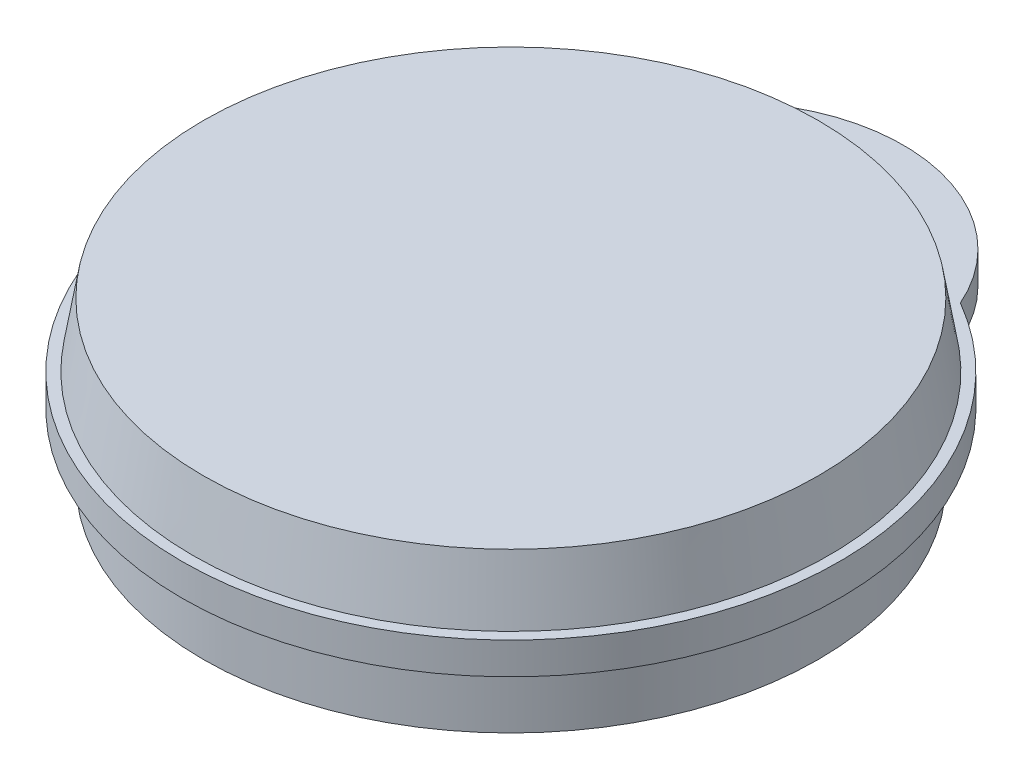
ISO-10303-21;
HEADER;
FILE_DESCRIPTION(('STEP AP214'),'2;1');
FILE_NAME('part.step','',(''),(''),'','','');
FILE_SCHEMA(('AUTOMOTIVE_DESIGN { 1 0 10303 214 1 1 1 1 }'));
ENDSEC;
DATA;
#1=APPLICATION_CONTEXT('core data for automotive mechanical design processes');
#2=APPLICATION_PROTOCOL_DEFINITION('international standard','automotive_design',2000,#1);
#3=PRODUCT_CONTEXT('',#1,'mechanical');
#4=PRODUCT('Part','Part','',(#3));
#5=PRODUCT_RELATED_PRODUCT_CATEGORY('part','',(#4));
#6=PRODUCT_DEFINITION_FORMATION('','',#4);
#7=PRODUCT_DEFINITION_CONTEXT('part definition',#1,'design');
#8=PRODUCT_DEFINITION('design','',#6,#7);
#9=PRODUCT_DEFINITION_SHAPE('','',#8);
#10=(LENGTH_UNIT() NAMED_UNIT(*) SI_UNIT(.MILLI.,.METRE.));
#11=(NAMED_UNIT(*) PLANE_ANGLE_UNIT() SI_UNIT($,.RADIAN.));
#12=(NAMED_UNIT(*) SI_UNIT($,.STERADIAN.) SOLID_ANGLE_UNIT());
#13=UNCERTAINTY_MEASURE_WITH_UNIT(LENGTH_MEASURE(1.E-05),#10,'distance_accuracy_value','');
#14=(GEOMETRIC_REPRESENTATION_CONTEXT(3) GLOBAL_UNCERTAINTY_ASSIGNED_CONTEXT((#13)) GLOBAL_UNIT_ASSIGNED_CONTEXT((#10,
#11,#12)) REPRESENTATION_CONTEXT('',''));
#15=CARTESIAN_POINT('',(0.,0.,0.));
#16=DIRECTION('',(0.,0.,1.));
#17=DIRECTION('',(1.,0.,0.));
#18=AXIS2_PLACEMENT_3D('',#15,#16,#17);
#19=CARTESIAN_POINT('',(0.,0.,0.));
#20=DIRECTION('',(0.,1.,0.));
#21=DIRECTION('',(0.,0.,1.));
#22=AXIS2_PLACEMENT_3D('',#19,#20,#21);
#23=PLANE('',#22);
#24=CARTESIAN_POINT('',(0.,0.,0.));
#25=DIRECTION('',(0.,1.,0.));
#26=DIRECTION('',(0.,0.,1.));
#27=AXIS2_PLACEMENT_3D('',#24,#25,#26);
#28=CIRCLE('',#27,14.5);
#29=CARTESIAN_POINT('',(0.,0.,14.5));
#30=VERTEX_POINT('',#29);
#31=EDGE_CURVE('E11',#30,#30,#28,.T.);
#32=ORIENTED_EDGE('',*,*,#31,.F.);
#33=EDGE_LOOP('',(#32));
#34=FACE_BOUND('',#33,.T.);
#35=ADVANCED_FACE('F33',(#34),#23,.F.);
#36=CARTESIAN_POINT('',(0.,7.5,0.));
#37=DIRECTION('',(0.,1.,0.));
#38=DIRECTION('',(0.,0.,1.));
#39=AXIS2_PLACEMENT_3D('',#36,#37,#38);
#40=CYLINDRICAL_SURFACE('',#39,14.5);
#41=CARTESIAN_POINT('',(0.,3.,0.));
#42=DIRECTION('',(0.,1.,0.));
#43=DIRECTION('',(0.,0.,1.));
#44=AXIS2_PLACEMENT_3D('',#41,#42,#43);
#45=CIRCLE('',#44,14.5);
#46=CARTESIAN_POINT('',(0.,3.,14.5));
#47=VERTEX_POINT('',#46);
#48=EDGE_CURVE('E40',#47,#47,#45,.T.);
#49=ORIENTED_EDGE('',*,*,#48,.F.);
#50=EDGE_LOOP('',(#49));
#51=FACE_BOUND('',#50,.T.);
#52=ORIENTED_EDGE('',*,*,#31,.T.);
#53=EDGE_LOOP('',(#52));
#54=FACE_BOUND('',#53,.T.);
#55=ADVANCED_FACE('F86',(#51,#54),#40,.T.);
#56=CARTESIAN_POINT('',(14.5,3.,0.));
#57=DIRECTION('',(0.,1.,0.));
#58=DIRECTION('',(0.,0.,1.));
#59=AXIS2_PLACEMENT_3D('',#56,#57,#58);
#60=PLANE('',#59);
#61=CARTESIAN_POINT('',(0.,3.,-10.));
#62=DIRECTION('',(0.,1.,0.));
#63=DIRECTION('',(0.,0.,1.));
#64=AXIS2_PLACEMENT_3D('',#61,#62,#63);
#65=CIRCLE('',#64,8.5);
#66=CARTESIAN_POINT('',(-7.79037868142493,3.,-13.4));
#67=VERTEX_POINT('',#66);
#68=CARTESIAN_POINT('',(7.79037868142493,3.,-13.4));
#69=VERTEX_POINT('',#68);
#70=EDGE_CURVE('E62',#67,#69,#65,.F.);
#71=ORIENTED_EDGE('',*,*,#70,.T.);
#72=CARTESIAN_POINT('',(0.,3.,0.));
#73=DIRECTION('',(0.,1.,0.));
#74=DIRECTION('',(0.,0.,1.));
#75=AXIS2_PLACEMENT_3D('',#72,#73,#74);
#76=CIRCLE('',#75,15.5);
#77=EDGE_CURVE('E47',#67,#69,#76,.T.);
#78=ORIENTED_EDGE('',*,*,#77,.F.);
#79=EDGE_LOOP('',(#71,#78));
#80=FACE_BOUND('',#79,.T.);
#81=ORIENTED_EDGE('',*,*,#48,.T.);
#82=EDGE_LOOP('',(#81));
#83=FACE_BOUND('',#82,.T.);
#84=ADVANCED_FACE('F59',(#80,#83),#60,.F.);
#85=CARTESIAN_POINT('',(0.,7.5,0.));
#86=DIRECTION('',(0.,1.,0.));
#87=DIRECTION('',(0.,0.,1.));
#88=AXIS2_PLACEMENT_3D('',#85,#86,#87);
#89=CYLINDRICAL_SURFACE('',#88,15.5);
#90=CARTESIAN_POINT('',(0.,4.5,0.));
#91=DIRECTION('',(0.,1.,0.));
#92=DIRECTION('',(0.,0.,1.));
#93=AXIS2_PLACEMENT_3D('',#90,#91,#92);
#94=CIRCLE('',#93,15.5);
#95=CARTESIAN_POINT('',(-7.79037868142493,4.5,-13.4));
#96=VERTEX_POINT('',#95);
#97=CARTESIAN_POINT('',(7.79037868142493,4.5,-13.4));
#98=VERTEX_POINT('',#97);
#99=EDGE_CURVE('E52',#96,#98,#94,.T.);
#100=ORIENTED_EDGE('',*,*,#99,.F.);
#101=DIRECTION('',(0.,1.,0.));
#102=VECTOR('',#101,1.);
#103=CARTESIAN_POINT('',(-7.79037868142493,3.75,-13.4));
#104=LINE('',#103,#102);
#105=EDGE_CURVE('E64',#96,#67,#104,.F.);
#106=ORIENTED_EDGE('',*,*,#105,.T.);
#107=ORIENTED_EDGE('',*,*,#77,.T.);
#108=DIRECTION('',(0.,1.,0.));
#109=VECTOR('',#108,1.);
#110=CARTESIAN_POINT('',(7.79037868142493,3.75,-13.4));
#111=LINE('',#110,#109);
#112=EDGE_CURVE('E70',#69,#98,#111,.T.);
#113=ORIENTED_EDGE('',*,*,#112,.T.);
#114=EDGE_LOOP('',(#100,#106,#107,#113));
#115=FACE_BOUND('',#114,.T.);
#116=ADVANCED_FACE('F65',(#115),#89,.T.);
#117=CARTESIAN_POINT('',(15.5,4.5,0.));
#118=DIRECTION('',(0.,-1.,0.));
#119=DIRECTION('',(0.,0.,-1.));
#120=AXIS2_PLACEMENT_3D('',#117,#118,#119);
#121=PLANE('',#120);
#122=CARTESIAN_POINT('',(0.,4.5,0.));
#123=DIRECTION('',(0.,1.,0.));
#124=DIRECTION('',(0.,0.,1.));
#125=AXIS2_PLACEMENT_3D('',#122,#123,#124);
#126=CIRCLE('',#125,15.);
#127=CARTESIAN_POINT('',(0.,4.5,15.));
#128=VERTEX_POINT('',#127);
#129=EDGE_CURVE('E80',#128,#128,#126,.T.);
#130=ORIENTED_EDGE('',*,*,#129,.F.);
#131=EDGE_LOOP('',(#130));
#132=FACE_BOUND('',#131,.T.);
#133=ORIENTED_EDGE('',*,*,#99,.T.);
#134=CARTESIAN_POINT('',(0.,4.5,-10.));
#135=DIRECTION('',(0.,1.,0.));
#136=DIRECTION('',(0.,0.,1.));
#137=AXIS2_PLACEMENT_3D('',#134,#135,#136);
#138=CIRCLE('',#137,8.5);
#139=EDGE_CURVE('E73',#98,#96,#138,.T.);
#140=ORIENTED_EDGE('',*,*,#139,.T.);
#141=EDGE_LOOP('',(#133,#140));
#142=FACE_BOUND('',#141,.T.);
#143=ADVANCED_FACE('F111',(#132,#142),#121,.F.);
#144=CARTESIAN_POINT('',(0.,4.5,0.));
#145=DIRECTION('',(0.,-1.,0.));
#146=DIRECTION('',(0.,0.,-1.));
#147=AXIS2_PLACEMENT_3D('',#144,#145,#146);
#148=CONICAL_SURFACE('',#147,15.,0.165148677414626);
#149=CARTESIAN_POINT('',(0.,7.5,0.));
#150=DIRECTION('',(0.,1.,0.));
#151=DIRECTION('',(0.,0.,1.));
#152=AXIS2_PLACEMENT_3D('',#149,#150,#151);
#153=CIRCLE('',#152,14.5);
#154=CARTESIAN_POINT('',(0.,7.5,14.5));
#155=VERTEX_POINT('',#154);
#156=EDGE_CURVE('E69',#155,#155,#153,.T.);
#157=ORIENTED_EDGE('',*,*,#156,.F.);
#158=EDGE_LOOP('',(#157));
#159=FACE_BOUND('',#158,.T.);
#160=ORIENTED_EDGE('',*,*,#129,.T.);
#161=EDGE_LOOP('',(#160));
#162=FACE_BOUND('',#161,.T.);
#163=ADVANCED_FACE('F118',(#159,#162),#148,.T.);
#164=CARTESIAN_POINT('',(14.5,7.5,0.));
#165=DIRECTION('',(0.,-1.,0.));
#166=DIRECTION('',(0.,0.,-1.));
#167=AXIS2_PLACEMENT_3D('',#164,#165,#166);
#168=PLANE('',#167);
#169=ORIENTED_EDGE('',*,*,#156,.T.);
#170=EDGE_LOOP('',(#169));
#171=FACE_BOUND('',#170,.T.);
#172=ADVANCED_FACE('F126',(#171),#168,.F.);
#173=CARTESIAN_POINT('',(0.,-14.1913722910651,-10.));
#174=DIRECTION('',(0.,1.,0.));
#175=DIRECTION('',(0.,0.,1.));
#176=AXIS2_PLACEMENT_3D('',#173,#174,#175);
#177=CYLINDRICAL_SURFACE('',#176,8.5);
#178=ORIENTED_EDGE('',*,*,#105,.F.);
#179=ORIENTED_EDGE('',*,*,#139,.F.);
#180=ORIENTED_EDGE('',*,*,#112,.F.);
#181=ORIENTED_EDGE('',*,*,#70,.F.);
#182=EDGE_LOOP('',(#178,#179,#180,#181));
#183=FACE_BOUND('',#182,.T.);
#184=ADVANCED_FACE('F72',(#183),#177,.T.);
#185=CLOSED_SHELL('',(#35,#55,#84,#116,#143,#163,#172,#184));
#186=MANIFOLD_SOLID_BREP('B2',#185);
#187=ADVANCED_BREP_SHAPE_REPRESENTATION('',(#18,#186),#14);
#188=SHAPE_DEFINITION_REPRESENTATION(#9,#187);
ENDSEC;
END-ISO-10303-21;
